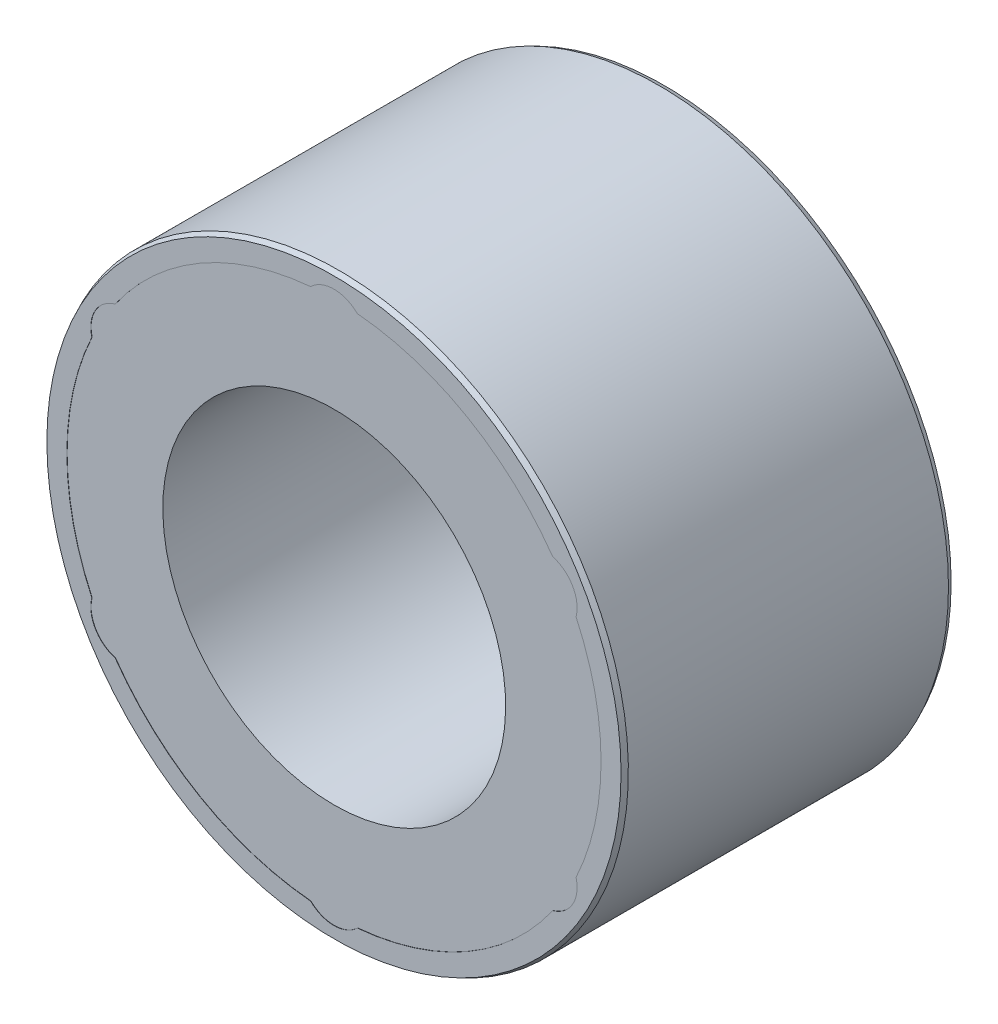
ISO-10303-21;
HEADER;
FILE_DESCRIPTION(('STEP AP214'),'2;1');
FILE_NAME('part.step','',(''),(''),'','','');
FILE_SCHEMA(('AUTOMOTIVE_DESIGN { 1 0 10303 214 1 1 1 1 }'));
ENDSEC;
DATA;
#1=APPLICATION_CONTEXT('core data for automotive mechanical design processes');
#2=APPLICATION_PROTOCOL_DEFINITION('international standard','automotive_design',2000,#1);
#3=PRODUCT_CONTEXT('',#1,'mechanical');
#4=PRODUCT('Part','Part','',(#3));
#5=PRODUCT_RELATED_PRODUCT_CATEGORY('part','',(#4));
#6=PRODUCT_DEFINITION_FORMATION('','',#4);
#7=PRODUCT_DEFINITION_CONTEXT('part definition',#1,'design');
#8=PRODUCT_DEFINITION('design','',#6,#7);
#9=PRODUCT_DEFINITION_SHAPE('','',#8);
#10=(LENGTH_UNIT() NAMED_UNIT(*) SI_UNIT(.MILLI.,.METRE.));
#11=(NAMED_UNIT(*) PLANE_ANGLE_UNIT() SI_UNIT($,.RADIAN.));
#12=(NAMED_UNIT(*) SI_UNIT($,.STERADIAN.) SOLID_ANGLE_UNIT());
#13=UNCERTAINTY_MEASURE_WITH_UNIT(LENGTH_MEASURE(1.E-05),#10,'distance_accuracy_value','');
#14=(GEOMETRIC_REPRESENTATION_CONTEXT(3) GLOBAL_UNCERTAINTY_ASSIGNED_CONTEXT((#13)) GLOBAL_UNIT_ASSIGNED_CONTEXT((#10,
#11,#12)) REPRESENTATION_CONTEXT('',''));
#15=CARTESIAN_POINT('',(0.,0.,0.));
#16=DIRECTION('',(0.,0.,1.));
#17=DIRECTION('',(1.,0.,0.));
#18=AXIS2_PLACEMENT_3D('',#15,#16,#17);
#19=CARTESIAN_POINT('',(0.,0.,-17.8020314050227));
#20=DIRECTION('',(0.,0.,1.));
#21=DIRECTION('',(1.,0.,0.));
#22=AXIS2_PLACEMENT_3D('',#19,#20,#21);
#23=CYLINDRICAL_SURFACE('',#22,54.9782499999894);
#24=CARTESIAN_POINT('',(0.,0.,-17.8020314050233));
#25=DIRECTION('',(0.,0.,1.));
#26=DIRECTION('',(0.342020143325751,-0.939692620785878,0.));
#27=AXIS2_PLACEMENT_3D('',#24,#25,#26);
#28=CIRCLE('',#27,54.9782499999998);
#29=CARTESIAN_POINT('',(18.8036689447989,-51.6626558287211,-17.8020314050233));
#30=VERTEX_POINT('',#29);
#31=EDGE_CURVE('E146',#30,#30,#28,.T.);
#32=ORIENTED_EDGE('',*,*,#31,.T.);
#33=EDGE_LOOP('',(#32));
#34=FACE_BOUND('',#33,.T.);
#35=CARTESIAN_POINT('',(-4.33343060550906E-13,-3.25965961481556E-13,43.0020314050139));
#36=DIRECTION('',(0.,0.,-1.));
#37=DIRECTION('',(0.342020143325753,-0.939692620785878,0.));
#38=AXIS2_PLACEMENT_3D('',#35,#36,#37);
#39=CIRCLE('',#38,54.9782500000053);
#40=CARTESIAN_POINT('',(18.8036689448004,-51.6626558287264,43.0020314050139));
#41=VERTEX_POINT('',#40);
#42=EDGE_CURVE('E240',#41,#41,#39,.T.);
#43=ORIENTED_EDGE('',*,*,#42,.T.);
#44=EDGE_LOOP('',(#43));
#45=FACE_BOUND('',#44,.T.);
#46=ADVANCED_FACE('F17',(#34,#45),#23,.T.);
#47=CARTESIAN_POINT('',(-4.33680868994202E-13,-3.2612801348364E-13,43.9500000000119));
#48=DIRECTION('',(0.,0.,-1.));
#49=DIRECTION('',(-1.,0.,0.));
#50=AXIS2_PLACEMENT_3D('',#47,#48,#49);
#51=CONICAL_SURFACE('',#50,54.5362050437735,0.436332261611004);
#52=CARTESIAN_POINT('',(-4.33680868994202E-13,-3.2612801348364E-13,43.9500000000109));
#53=DIRECTION('',(0.,0.,-1.));
#54=DIRECTION('',(-1.,0.,0.));
#55=AXIS2_PLACEMENT_3D('',#52,#53,#54);
#56=CIRCLE('',#55,54.536205043774);
#57=CARTESIAN_POINT('',(-54.5362050437744,-3.2612801348364E-13,43.9500000000109));
#58=VERTEX_POINT('',#57);
#59=EDGE_CURVE('E235',#58,#58,#56,.T.);
#60=ORIENTED_EDGE('',*,*,#59,.T.);
#61=EDGE_LOOP('',(#60));
#62=FACE_BOUND('',#61,.T.);
#63=ORIENTED_EDGE('',*,*,#42,.F.);
#64=EDGE_LOOP('',(#63));
#65=FACE_BOUND('',#64,.T.);
#66=ADVANCED_FACE('F653',(#62,#65),#51,.T.);
#67=CARTESIAN_POINT('',(0.,0.,-18.7499999999988));
#68=DIRECTION('',(0.,0.,1.));
#69=DIRECTION('',(1.,0.,0.));
#70=AXIS2_PLACEMENT_3D('',#67,#68,#69);
#71=CONICAL_SURFACE('',#70,54.5362050437752,0.436332261613966);
#72=CARTESIAN_POINT('',(0.,0.,-18.7499999999988));
#73=DIRECTION('',(0.,0.,1.));
#74=DIRECTION('',(1.,0.,0.));
#75=AXIS2_PLACEMENT_3D('',#72,#73,#74);
#76=CIRCLE('',#75,54.5362050437752);
#77=CARTESIAN_POINT('',(54.5362050437752,0.,-18.7499999999988));
#78=VERTEX_POINT('',#77);
#79=EDGE_CURVE('E230',#78,#78,#76,.T.);
#80=ORIENTED_EDGE('',*,*,#79,.T.);
#81=EDGE_LOOP('',(#80));
#82=FACE_BOUND('',#81,.T.);
#83=ORIENTED_EDGE('',*,*,#31,.F.);
#84=EDGE_LOOP('',(#83));
#85=FACE_BOUND('',#84,.T.);
#86=ADVANCED_FACE('F646',(#82,#85),#71,.T.);
#87=CARTESIAN_POINT('',(-33.898580331101,-72.6957401152648,43.950000000002));
#88=DIRECTION('',(0.,0.,1.));
#89=DIRECTION('',(0.939692620785899,0.342020143325696,0.));
#90=AXIS2_PLACEMENT_3D('',#87,#88,#89);
#91=PLANE('',#90);
#92=CARTESIAN_POINT('',(0.,0.,43.950000000002));
#93=DIRECTION('',(0.,0.,1.));
#94=DIRECTION('',(1.,0.,0.));
#95=AXIS2_PLACEMENT_3D('',#92,#93,#94);
#96=CIRCLE('',#95,50.7365);
#97=CARTESIAN_POINT('',(4.43690895929302,50.5421237299833,43.950000000002));
#98=VERTEX_POINT('',#97);
#99=CARTESIAN_POINT('',(41.5523086317388,29.1135377380193,43.950000000002));
#100=VERTEX_POINT('',#99);
#101=EDGE_CURVE('E224',#98,#100,#96,.F.);
#102=ORIENTED_EDGE('',*,*,#101,.T.);
#103=CARTESIAN_POINT('',(39.8366489588516,22.9997,43.950000000002));
#104=DIRECTION('',(0.,0.,1.));
#105=DIRECTION('',(1.,0.,0.));
#106=AXIS2_PLACEMENT_3D('',#103,#104,#105);
#107=CIRCLE('',#106,6.35);
#108=CARTESIAN_POINT('',(45.9892175910322,21.4285859919569,43.950000000002));
#109=VERTEX_POINT('',#108);
#110=EDGE_CURVE('E214',#100,#109,#107,.F.);
#111=ORIENTED_EDGE('',*,*,#110,.T.);
#112=CARTESIAN_POINT('',(0.,0.,43.950000000002));
#113=DIRECTION('',(0.,0.,1.));
#114=DIRECTION('',(1.,0.,0.));
#115=AXIS2_PLACEMENT_3D('',#112,#113,#114);
#116=CIRCLE('',#115,50.7365);
#117=CARTESIAN_POINT('',(45.9892175910349,-21.4285859919553,43.950000000002));
#118=VERTEX_POINT('',#117);
#119=EDGE_CURVE('E211',#109,#118,#116,.F.);
#120=ORIENTED_EDGE('',*,*,#119,.T.);
#121=CARTESIAN_POINT('',(39.8366489588516,-22.9997,43.950000000002));
#122=DIRECTION('',(0.,0.,1.));
#123=DIRECTION('',(1.,0.,0.));
#124=AXIS2_PLACEMENT_3D('',#121,#122,#123);
#125=CIRCLE('',#124,6.35);
#126=CARTESIAN_POINT('',(41.5523086317375,-29.1135377380152,43.950000000002));
#127=VERTEX_POINT('',#126);
#128=EDGE_CURVE('E208',#118,#127,#125,.F.);
#129=ORIENTED_EDGE('',*,*,#128,.T.);
#130=CARTESIAN_POINT('',(0.,0.,43.950000000002));
#131=DIRECTION('',(0.,0.,1.));
#132=DIRECTION('',(1.,0.,0.));
#133=AXIS2_PLACEMENT_3D('',#130,#131,#132);
#134=CIRCLE('',#133,50.7365);
#135=CARTESIAN_POINT('',(4.43690895929385,-50.5421237299816,43.950000000002));
#136=VERTEX_POINT('',#135);
#137=EDGE_CURVE('E204',#127,#136,#134,.F.);
#138=ORIENTED_EDGE('',*,*,#137,.T.);
#139=CARTESIAN_POINT('',(0.,-45.9994,43.950000000002));
#140=DIRECTION('',(0.,0.,1.));
#141=DIRECTION('',(1.,0.,0.));
#142=AXIS2_PLACEMENT_3D('',#139,#140,#141);
#143=CIRCLE('',#142,6.35);
#144=CARTESIAN_POINT('',(-4.43690895929303,-50.5421237299833,43.950000000002));
#145=VERTEX_POINT('',#144);
#146=EDGE_CURVE('E200',#136,#145,#143,.F.);
#147=ORIENTED_EDGE('',*,*,#146,.T.);
#148=CARTESIAN_POINT('',(0.,0.,43.950000000002));
#149=DIRECTION('',(0.,0.,1.));
#150=DIRECTION('',(1.,0.,0.));
#151=AXIS2_PLACEMENT_3D('',#148,#149,#150);
#152=CIRCLE('',#151,50.7365);
#153=CARTESIAN_POINT('',(-41.5523086317388,-29.1135377380193,43.950000000002));
#154=VERTEX_POINT('',#153);
#155=EDGE_CURVE('E196',#145,#154,#152,.F.);
#156=ORIENTED_EDGE('',*,*,#155,.T.);
#157=CARTESIAN_POINT('',(-39.8366489588516,-22.9997,43.950000000002));
#158=DIRECTION('',(0.,0.,1.));
#159=DIRECTION('',(1.,0.,0.));
#160=AXIS2_PLACEMENT_3D('',#157,#158,#159);
#161=CIRCLE('',#160,6.35);
#162=CARTESIAN_POINT('',(-45.9892175910322,-21.4285859919569,43.950000000002));
#163=VERTEX_POINT('',#162);
#164=EDGE_CURVE('E192',#154,#163,#161,.F.);
#165=ORIENTED_EDGE('',*,*,#164,.T.);
#166=CARTESIAN_POINT('',(0.,0.,43.950000000002));
#167=DIRECTION('',(0.,0.,1.));
#168=DIRECTION('',(1.,0.,0.));
#169=AXIS2_PLACEMENT_3D('',#166,#167,#168);
#170=CIRCLE('',#169,50.7365);
#171=CARTESIAN_POINT('',(-45.9892175910349,21.4285859919553,43.950000000002));
#172=VERTEX_POINT('',#171);
#173=EDGE_CURVE('E188',#163,#172,#170,.F.);
#174=ORIENTED_EDGE('',*,*,#173,.T.);
#175=CARTESIAN_POINT('',(-39.8366489588516,22.9997,43.950000000002));
#176=DIRECTION('',(0.,0.,1.));
#177=DIRECTION('',(1.,0.,0.));
#178=AXIS2_PLACEMENT_3D('',#175,#176,#177);
#179=CIRCLE('',#178,6.35);
#180=CARTESIAN_POINT('',(-41.5523086317375,29.1135377380152,43.950000000002));
#181=VERTEX_POINT('',#180);
#182=EDGE_CURVE('E184',#172,#181,#179,.F.);
#183=ORIENTED_EDGE('',*,*,#182,.T.);
#184=CARTESIAN_POINT('',(0.,0.,43.950000000002));
#185=DIRECTION('',(0.,0.,1.));
#186=DIRECTION('',(1.,0.,0.));
#187=AXIS2_PLACEMENT_3D('',#184,#185,#186);
#188=CIRCLE('',#187,50.7365);
#189=CARTESIAN_POINT('',(-4.43690895929304,50.5421237299833,43.950000000002));
#190=VERTEX_POINT('',#189);
#191=EDGE_CURVE('E179',#181,#190,#188,.F.);
#192=ORIENTED_EDGE('',*,*,#191,.T.);
#193=CARTESIAN_POINT('',(0.,45.9994,43.950000000002));
#194=DIRECTION('',(0.,0.,1.));
#195=DIRECTION('',(1.,0.,0.));
#196=AXIS2_PLACEMENT_3D('',#193,#194,#195);
#197=CIRCLE('',#196,6.35);
#198=EDGE_CURVE('E112',#190,#98,#197,.F.);
#199=ORIENTED_EDGE('',*,*,#198,.T.);
#200=EDGE_LOOP('',(#102,#111,#120,#129,#138,#147,#156,#165,#174,#183,#192,#199));
#201=FACE_BOUND('',#200,.T.);
#202=ORIENTED_EDGE('',*,*,#59,.F.);
#203=EDGE_LOOP('',(#202));
#204=FACE_BOUND('',#203,.T.);
#205=ADVANCED_FACE('F261',(#201,#204),#91,.T.);
#206=CARTESIAN_POINT('',(-33.898580330974,-72.695740115214,-18.7500000000012));
#207=DIRECTION('',(0.,0.,1.));
#208=DIRECTION('',(0.939692620785924,0.342020143325624,0.));
#209=AXIS2_PLACEMENT_3D('',#206,#207,#208);
#210=PLANE('',#209);
#211=DIRECTION('',(0.940586434343421,0.339554354307421,0.));
#212=VECTOR('',#211,1.);
#213=CARTESIAN_POINT('',(17.0270681670361,-47.5561941904999,-18.7500000000012));
#214=LINE('',#213,#212);
#215=CARTESIAN_POINT('',(17.0270681670361,-47.5561941904999,-18.7500000000002));
#216=VERTEX_POINT('',#215);
#217=CARTESIAN_POINT('',(17.276292489739,-47.4662235074419,-18.75));
#218=VERTEX_POINT('',#217);
#219=EDGE_CURVE('E120',#216,#218,#214,.T.);
#220=ORIENTED_EDGE('',*,*,#219,.T.);
#221=CARTESIAN_POINT('',(0.,0.,-18.7499999999992));
#222=DIRECTION('',(0.,0.,-1.));
#223=DIRECTION('',(-0.337086229488414,0.941473777589841,0.));
#224=AXIS2_PLACEMENT_3D('',#221,#222,#223);
#225=CIRCLE('',#224,50.5124999999955);
#226=CARTESIAN_POINT('',(-17.0270681670313,47.5561941905006,-18.7500000000002));
#227=VERTEX_POINT('',#226);
#228=EDGE_CURVE('E131',#218,#227,#225,.F.);
#229=ORIENTED_EDGE('',*,*,#228,.T.);
#230=DIRECTION('',(-0.940586434343412,-0.339554354307445,0.));
#231=VECTOR('',#230,1.);
#232=CARTESIAN_POINT('',(-17.027068167031,47.5561941904999,-18.7500000000012));
#233=LINE('',#232,#231);
#234=CARTESIAN_POINT('',(-17.2762924897388,47.4662235074414,-18.75));
#235=VERTEX_POINT('',#234);
#236=EDGE_CURVE('E126',#235,#227,#233,.F.);
#237=ORIENTED_EDGE('',*,*,#236,.F.);
#238=CARTESIAN_POINT('',(0.,0.,-18.7499999999992));
#239=DIRECTION('',(0.,0.,-1.));
#240=DIRECTION('',(0.337086159115484,-0.941473802786233,0.));
#241=AXIS2_PLACEMENT_3D('',#238,#239,#240);
#242=CIRCLE('',#241,50.5124999999944);
#243=EDGE_CURVE('E133',#235,#216,#242,.F.);
#244=ORIENTED_EDGE('',*,*,#243,.T.);
#245=EDGE_LOOP('',(#220,#229,#237,#244));
#246=FACE_BOUND('',#245,.T.);
#247=ORIENTED_EDGE('',*,*,#79,.F.);
#248=EDGE_LOOP('',(#247));
#249=FACE_BOUND('',#248,.T.);
#250=ADVANCED_FACE('F129',(#246,#249),#210,.F.);
#251=CARTESIAN_POINT('',(0.,45.9994,43.899200000002));
#252=DIRECTION('',(0.,0.,1.));
#253=DIRECTION('',(1.,0.,0.));
#254=AXIS2_PLACEMENT_3D('',#251,#252,#253);
#255=CYLINDRICAL_SURFACE('',#254,6.35);
#256=CARTESIAN_POINT('',(0.,45.9994,43.899200000002));
#257=DIRECTION('',(0.,0.,1.));
#258=DIRECTION('',(1.,0.,0.));
#259=AXIS2_PLACEMENT_3D('',#256,#257,#258);
#260=CIRCLE('',#259,6.35);
#261=CARTESIAN_POINT('',(-4.43690895929304,50.5421237299833,43.899200000002));
#262=VERTEX_POINT('',#261);
#263=CARTESIAN_POINT('',(4.43690895929302,50.5421237299833,43.899200000002));
#264=VERTEX_POINT('',#263);
#265=EDGE_CURVE('E138',#262,#264,#260,.F.);
#266=ORIENTED_EDGE('',*,*,#265,.T.);
#267=DIRECTION('',(0.,0.,-1.));
#268=VECTOR('',#267,1.);
#269=CARTESIAN_POINT('',(4.43690895929412,50.5421237299832,43.924600000002));
#270=LINE('',#269,#268);
#271=EDGE_CURVE('E141',#264,#98,#270,.F.);
#272=ORIENTED_EDGE('',*,*,#271,.T.);
#273=ORIENTED_EDGE('',*,*,#198,.F.);
#274=DIRECTION('',(0.,0.,1.));
#275=VECTOR('',#274,1.);
#276=CARTESIAN_POINT('',(-4.43690895929411,50.5421237299832,43.924600000002));
#277=LINE('',#276,#275);
#278=EDGE_CURVE('E177',#190,#262,#277,.F.);
#279=ORIENTED_EDGE('',*,*,#278,.T.);
#280=EDGE_LOOP('',(#266,#272,#273,#279));
#281=FACE_BOUND('',#280,.T.);
#282=ADVANCED_FACE('F260',(#281),#255,.F.);
#283=CARTESIAN_POINT('',(0.,0.,43.899200000002));
#284=DIRECTION('',(0.,0.,1.));
#285=DIRECTION('',(1.,0.,0.));
#286=AXIS2_PLACEMENT_3D('',#283,#284,#285);
#287=CYLINDRICAL_SURFACE('',#286,50.7365);
#288=CARTESIAN_POINT('',(0.,0.,43.899200000002));
#289=DIRECTION('',(0.,0.,1.));
#290=DIRECTION('',(1.,0.,0.));
#291=AXIS2_PLACEMENT_3D('',#288,#289,#290);
#292=CIRCLE('',#291,50.7365);
#293=CARTESIAN_POINT('',(41.5523086317388,29.1135377380193,43.899200000002));
#294=VERTEX_POINT('',#293);
#295=EDGE_CURVE('E333',#264,#294,#292,.F.);
#296=ORIENTED_EDGE('',*,*,#295,.T.);
#297=DIRECTION('',(0.,0.,-1.));
#298=VECTOR('',#297,1.);
#299=CARTESIAN_POINT('',(41.552308631744,29.1135377380178,43.924600000002));
#300=LINE('',#299,#298);
#301=EDGE_CURVE('E212',#294,#100,#300,.F.);
#302=ORIENTED_EDGE('',*,*,#301,.T.);
#303=ORIENTED_EDGE('',*,*,#101,.F.);
#304=ORIENTED_EDGE('',*,*,#271,.F.);
#305=EDGE_LOOP('',(#296,#302,#303,#304));
#306=FACE_BOUND('',#305,.T.);
#307=ADVANCED_FACE('F618',(#306),#287,.F.);
#308=CARTESIAN_POINT('',(39.8366489588516,22.9997,43.899200000002));
#309=DIRECTION('',(0.,0.,1.));
#310=DIRECTION('',(1.,0.,0.));
#311=AXIS2_PLACEMENT_3D('',#308,#309,#310);
#312=CYLINDRICAL_SURFACE('',#311,6.35);
#313=CARTESIAN_POINT('',(39.8366489588516,22.9997,43.899200000002));
#314=DIRECTION('',(0.,0.,1.));
#315=DIRECTION('',(1.,0.,0.));
#316=AXIS2_PLACEMENT_3D('',#313,#314,#315);
#317=CIRCLE('',#316,6.35);
#318=CARTESIAN_POINT('',(45.9892175910322,21.4285859919569,43.899200000002));
#319=VERTEX_POINT('',#318);
#320=EDGE_CURVE('E331',#294,#319,#317,.F.);
#321=ORIENTED_EDGE('',*,*,#320,.T.);
#322=DIRECTION('',(0.,0.,-1.));
#323=VECTOR('',#322,1.);
#324=CARTESIAN_POINT('',(45.9892175910303,21.4285859919611,43.924600000002));
#325=LINE('',#324,#323);
#326=EDGE_CURVE('E209',#319,#109,#325,.F.);
#327=ORIENTED_EDGE('',*,*,#326,.T.);
#328=ORIENTED_EDGE('',*,*,#110,.F.);
#329=ORIENTED_EDGE('',*,*,#301,.F.);
#330=EDGE_LOOP('',(#321,#327,#328,#329));
#331=FACE_BOUND('',#330,.T.);
#332=ADVANCED_FACE('F609',(#331),#312,.F.);
#333=CARTESIAN_POINT('',(0.,0.,43.899200000002));
#334=DIRECTION('',(0.,0.,1.));
#335=DIRECTION('',(1.,0.,0.));
#336=AXIS2_PLACEMENT_3D('',#333,#334,#335);
#337=CYLINDRICAL_SURFACE('',#336,50.7365);
#338=ORIENTED_EDGE('',*,*,#326,.F.);
#339=CARTESIAN_POINT('',(0.,0.,43.899200000002));
#340=DIRECTION('',(0.,0.,1.));
#341=DIRECTION('',(1.,0.,0.));
#342=AXIS2_PLACEMENT_3D('',#339,#340,#341);
#343=CIRCLE('',#342,50.7365);
#344=CARTESIAN_POINT('',(45.9892175910349,-21.4285859919553,43.899200000002));
#345=VERTEX_POINT('',#344);
#346=EDGE_CURVE('E328',#319,#345,#343,.F.);
#347=ORIENTED_EDGE('',*,*,#346,.T.);
#348=DIRECTION('',(0.,0.,-1.));
#349=VECTOR('',#348,1.);
#350=CARTESIAN_POINT('',(45.9892175910356,-21.428585991958,43.924600000002));
#351=LINE('',#350,#349);
#352=EDGE_CURVE('E205',#345,#118,#351,.F.);
#353=ORIENTED_EDGE('',*,*,#352,.T.);
#354=ORIENTED_EDGE('',*,*,#119,.F.);
#355=EDGE_LOOP('',(#338,#347,#353,#354));
#356=FACE_BOUND('',#355,.T.);
#357=ADVANCED_FACE('F601',(#356),#337,.F.);
#358=CARTESIAN_POINT('',(39.8366489588516,-22.9997,43.899200000002));
#359=DIRECTION('',(0.,0.,1.));
#360=DIRECTION('',(1.,0.,0.));
#361=AXIS2_PLACEMENT_3D('',#358,#359,#360);
#362=CYLINDRICAL_SURFACE('',#361,6.35);
#363=ORIENTED_EDGE('',*,*,#352,.F.);
#364=CARTESIAN_POINT('',(39.8366489588516,-22.9997,43.899200000002));
#365=DIRECTION('',(0.,0.,1.));
#366=DIRECTION('',(1.,0.,0.));
#367=AXIS2_PLACEMENT_3D('',#364,#365,#366);
#368=CIRCLE('',#367,6.35);
#369=CARTESIAN_POINT('',(41.5523086317375,-29.1135377380152,43.899200000002));
#370=VERTEX_POINT('',#369);
#371=EDGE_CURVE('E325',#345,#370,#368,.F.);
#372=ORIENTED_EDGE('',*,*,#371,.T.);
#373=DIRECTION('',(0.,0.,-1.));
#374=VECTOR('',#373,1.);
#375=CARTESIAN_POINT('',(41.5523086317413,-29.1135377380097,43.924600000002));
#376=LINE('',#375,#374);
#377=EDGE_CURVE('E201',#370,#127,#376,.F.);
#378=ORIENTED_EDGE('',*,*,#377,.T.);
#379=ORIENTED_EDGE('',*,*,#128,.F.);
#380=EDGE_LOOP('',(#363,#372,#378,#379));
#381=FACE_BOUND('',#380,.T.);
#382=ADVANCED_FACE('F356',(#381),#362,.F.);
#383=CARTESIAN_POINT('',(0.,0.,43.899200000002));
#384=DIRECTION('',(0.,0.,1.));
#385=DIRECTION('',(1.,0.,0.));
#386=AXIS2_PLACEMENT_3D('',#383,#384,#385);
#387=CYLINDRICAL_SURFACE('',#386,50.7365);
#388=CARTESIAN_POINT('',(0.,0.,43.899200000002));
#389=DIRECTION('',(0.,0.,1.));
#390=DIRECTION('',(1.,0.,0.));
#391=AXIS2_PLACEMENT_3D('',#388,#389,#390);
#392=CIRCLE('',#391,50.7365);
#393=CARTESIAN_POINT('',(4.43690895929385,-50.5421237299816,43.899200000002));
#394=VERTEX_POINT('',#393);
#395=EDGE_CURVE('E322',#370,#394,#392,.F.);
#396=ORIENTED_EDGE('',*,*,#395,.T.);
#397=DIRECTION('',(0.,0.,-1.));
#398=VECTOR('',#397,1.);
#399=CARTESIAN_POINT('',(4.43690895929573,-50.5421237299798,43.924600000002));
#400=LINE('',#399,#398);
#401=EDGE_CURVE('E197',#394,#136,#400,.F.);
#402=ORIENTED_EDGE('',*,*,#401,.T.);
#403=ORIENTED_EDGE('',*,*,#137,.F.);
#404=ORIENTED_EDGE('',*,*,#377,.F.);
#405=EDGE_LOOP('',(#396,#402,#403,#404));
#406=FACE_BOUND('',#405,.T.);
#407=ADVANCED_FACE('F359',(#406),#387,.F.);
#408=CARTESIAN_POINT('',(0.,-45.9994,43.899200000002));
#409=DIRECTION('',(0.,0.,1.));
#410=DIRECTION('',(1.,0.,0.));
#411=AXIS2_PLACEMENT_3D('',#408,#409,#410);
#412=CYLINDRICAL_SURFACE('',#411,6.35);
#413=CARTESIAN_POINT('',(0.,-45.9994,43.899200000002));
#414=DIRECTION('',(0.,0.,1.));
#415=DIRECTION('',(1.,0.,0.));
#416=AXIS2_PLACEMENT_3D('',#413,#414,#415);
#417=CIRCLE('',#416,6.35);
#418=CARTESIAN_POINT('',(-4.43690895929303,-50.5421237299833,43.899200000002));
#419=VERTEX_POINT('',#418);
#420=EDGE_CURVE('E319',#394,#419,#417,.F.);
#421=ORIENTED_EDGE('',*,*,#420,.T.);
#422=DIRECTION('',(0.,0.,-1.));
#423=VECTOR('',#422,1.);
#424=CARTESIAN_POINT('',(-4.43690895929414,-50.5421237299832,43.924600000002));
#425=LINE('',#424,#423);
#426=EDGE_CURVE('E193',#419,#145,#425,.F.);
#427=ORIENTED_EDGE('',*,*,#426,.T.);
#428=ORIENTED_EDGE('',*,*,#146,.F.);
#429=ORIENTED_EDGE('',*,*,#401,.F.);
#430=EDGE_LOOP('',(#421,#427,#428,#429));
#431=FACE_BOUND('',#430,.T.);
#432=ADVANCED_FACE('F366',(#431),#412,.F.);
#433=CARTESIAN_POINT('',(0.,0.,43.899200000002));
#434=DIRECTION('',(0.,0.,1.));
#435=DIRECTION('',(1.,0.,0.));
#436=AXIS2_PLACEMENT_3D('',#433,#434,#435);
#437=CYLINDRICAL_SURFACE('',#436,50.7365);
#438=CARTESIAN_POINT('',(0.,0.,43.899200000002));
#439=DIRECTION('',(0.,0.,1.));
#440=DIRECTION('',(1.,0.,0.));
#441=AXIS2_PLACEMENT_3D('',#438,#439,#440);
#442=CIRCLE('',#441,50.7365);
#443=CARTESIAN_POINT('',(-41.5523086317388,-29.1135377380193,43.899200000002));
#444=VERTEX_POINT('',#443);
#445=EDGE_CURVE('E316',#419,#444,#442,.F.);
#446=ORIENTED_EDGE('',*,*,#445,.T.);
#447=DIRECTION('',(0.,0.,-1.));
#448=VECTOR('',#447,1.);
#449=CARTESIAN_POINT('',(-41.552308631744,-29.1135377380178,43.924600000002));
#450=LINE('',#449,#448);
#451=EDGE_CURVE('E189',#444,#154,#450,.F.);
#452=ORIENTED_EDGE('',*,*,#451,.T.);
#453=ORIENTED_EDGE('',*,*,#155,.F.);
#454=ORIENTED_EDGE('',*,*,#426,.F.);
#455=EDGE_LOOP('',(#446,#452,#453,#454));
#456=FACE_BOUND('',#455,.T.);
#457=ADVANCED_FACE('F368',(#456),#437,.F.);
#458=CARTESIAN_POINT('',(-39.8366489588516,-22.9997,43.899200000002));
#459=DIRECTION('',(0.,0.,1.));
#460=DIRECTION('',(1.,0.,0.));
#461=AXIS2_PLACEMENT_3D('',#458,#459,#460);
#462=CYLINDRICAL_SURFACE('',#461,6.35);
#463=CARTESIAN_POINT('',(-39.8366489588516,-22.9997,43.899200000002));
#464=DIRECTION('',(0.,0.,1.));
#465=DIRECTION('',(1.,0.,0.));
#466=AXIS2_PLACEMENT_3D('',#463,#464,#465);
#467=CIRCLE('',#466,6.35);
#468=CARTESIAN_POINT('',(-45.9892175910322,-21.4285859919569,43.899200000002));
#469=VERTEX_POINT('',#468);
#470=EDGE_CURVE('E314',#444,#469,#467,.F.);
#471=ORIENTED_EDGE('',*,*,#470,.T.);
#472=DIRECTION('',(0.,0.,-1.));
#473=VECTOR('',#472,1.);
#474=CARTESIAN_POINT('',(-45.9892175910303,-21.4285859919611,43.924600000002));
#475=LINE('',#474,#473);
#476=EDGE_CURVE('E185',#469,#163,#475,.F.);
#477=ORIENTED_EDGE('',*,*,#476,.T.);
#478=ORIENTED_EDGE('',*,*,#164,.F.);
#479=ORIENTED_EDGE('',*,*,#451,.F.);
#480=EDGE_LOOP('',(#471,#477,#478,#479));
#481=FACE_BOUND('',#480,.T.);
#482=ADVANCED_FACE('F370',(#481),#462,.F.);
#483=CARTESIAN_POINT('',(0.,0.,43.899200000002));
#484=DIRECTION('',(0.,0.,1.));
#485=DIRECTION('',(1.,0.,0.));
#486=AXIS2_PLACEMENT_3D('',#483,#484,#485);
#487=CYLINDRICAL_SURFACE('',#486,50.7365);
#488=ORIENTED_EDGE('',*,*,#476,.F.);
#489=CARTESIAN_POINT('',(0.,0.,43.899200000002));
#490=DIRECTION('',(0.,0.,1.));
#491=DIRECTION('',(1.,0.,0.));
#492=AXIS2_PLACEMENT_3D('',#489,#490,#491);
#493=CIRCLE('',#492,50.7365);
#494=CARTESIAN_POINT('',(-45.9892175910349,21.4285859919553,43.899200000002));
#495=VERTEX_POINT('',#494);
#496=EDGE_CURVE('E311',#469,#495,#493,.F.);
#497=ORIENTED_EDGE('',*,*,#496,.T.);
#498=DIRECTION('',(0.,0.,-1.));
#499=VECTOR('',#498,1.);
#500=CARTESIAN_POINT('',(-45.9892175910356,21.428585991958,43.924600000002));
#501=LINE('',#500,#499);
#502=EDGE_CURVE('E181',#495,#172,#501,.F.);
#503=ORIENTED_EDGE('',*,*,#502,.T.);
#504=ORIENTED_EDGE('',*,*,#173,.F.);
#505=EDGE_LOOP('',(#488,#497,#503,#504));
#506=FACE_BOUND('',#505,.T.);
#507=ADVANCED_FACE('F375',(#506),#487,.F.);
#508=CARTESIAN_POINT('',(-39.8366489588516,22.9997,43.899200000002));
#509=DIRECTION('',(0.,0.,1.));
#510=DIRECTION('',(1.,0.,0.));
#511=AXIS2_PLACEMENT_3D('',#508,#509,#510);
#512=CYLINDRICAL_SURFACE('',#511,6.35);
#513=ORIENTED_EDGE('',*,*,#502,.F.);
#514=CARTESIAN_POINT('',(-39.8366489588516,22.9997,43.899200000002));
#515=DIRECTION('',(0.,0.,1.));
#516=DIRECTION('',(1.,0.,0.));
#517=AXIS2_PLACEMENT_3D('',#514,#515,#516);
#518=CIRCLE('',#517,6.35);
#519=CARTESIAN_POINT('',(-41.5523086317375,29.1135377380152,43.899200000002));
#520=VERTEX_POINT('',#519);
#521=EDGE_CURVE('E308',#495,#520,#518,.F.);
#522=ORIENTED_EDGE('',*,*,#521,.T.);
#523=DIRECTION('',(0.,0.,-1.));
#524=VECTOR('',#523,1.);
#525=CARTESIAN_POINT('',(-41.5523086317413,29.1135377380097,43.924600000002));
#526=LINE('',#525,#524);
#527=EDGE_CURVE('E38',#520,#181,#526,.F.);
#528=ORIENTED_EDGE('',*,*,#527,.T.);
#529=ORIENTED_EDGE('',*,*,#182,.F.);
#530=EDGE_LOOP('',(#513,#522,#528,#529));
#531=FACE_BOUND('',#530,.T.);
#532=ADVANCED_FACE('F377',(#531),#512,.F.);
#533=CARTESIAN_POINT('',(0.,0.,43.899200000002));
#534=DIRECTION('',(0.,0.,1.));
#535=DIRECTION('',(1.,0.,0.));
#536=AXIS2_PLACEMENT_3D('',#533,#534,#535);
#537=CYLINDRICAL_SURFACE('',#536,50.7365);
#538=CARTESIAN_POINT('',(0.,0.,43.899200000002));
#539=DIRECTION('',(0.,0.,1.));
#540=DIRECTION('',(1.,0.,0.));
#541=AXIS2_PLACEMENT_3D('',#538,#539,#540);
#542=CIRCLE('',#541,50.7365);
#543=EDGE_CURVE('E176',#520,#262,#542,.F.);
#544=ORIENTED_EDGE('',*,*,#543,.T.);
#545=ORIENTED_EDGE('',*,*,#278,.F.);
#546=ORIENTED_EDGE('',*,*,#191,.F.);
#547=ORIENTED_EDGE('',*,*,#527,.F.);
#548=EDGE_LOOP('',(#544,#545,#546,#547));
#549=FACE_BOUND('',#548,.T.);
#550=ADVANCED_FACE('F159',(#549),#537,.F.);
#551=CARTESIAN_POINT('',(16.9832650347526,-47.4338642617394,-18.615916601319));
#552=CARTESIAN_POINT('',(16.9824179649364,-47.4314984154433,-18.6958789429001));
#553=CARTESIAN_POINT('',(17.0014868709001,-47.4847574263137,-18.7524487706667));
#554=CARTESIAN_POINT('',(17.0284410694976,-47.5600398761217,-18.7499358528467));
#555=(BOUNDED_CURVE() B_SPLINE_CURVE(3,(#551,#552,#553,#554),.UNSPECIFIED.,.F.,
.F.) B_SPLINE_CURVE_WITH_KNOTS((4,4),(0.,1.),
.UNSPECIFIED.) CURVE() GEOMETRIC_REPRESENTATION_ITEM() RATIONAL_B_SPLINE_CURVE((1.,
0.789698070619091,0.789698070619091,1.)) REPRESENTATION_ITEM(''));
#556=CARTESIAN_POINT('',(0.,0.,-18.6199999999992));
#557=DIRECTION('',(0.,0.,1.));
#558=AXIS1_PLACEMENT('',#556,#557);
#559=SURFACE_OF_REVOLUTION('',#555,#558);
#560=CARTESIAN_POINT('',(0.,0.,-18.6199999999992));
#561=DIRECTION('',(0.,0.,1.));
#562=DIRECTION('',(-0.342020143325583,0.93969262078594,0.));
#563=AXIS2_PLACEMENT_3D('',#560,#561,#562);
#564=CIRCLE('',#563,50.3825000000036);
#565=CARTESIAN_POINT('',(-17.2318298711024,47.344063466751,-18.6199999999992));
#566=VERTEX_POINT('',#565);
#567=EDGE_CURVE('E169',#566,#566,#564,.T.);
#568=ORIENTED_EDGE('',*,*,#567,.T.);
#569=EDGE_LOOP('',(#568));
#570=FACE_BOUND('',#569,.T.);
#571=ORIENTED_EDGE('',*,*,#228,.F.);
#572=ORIENTED_EDGE('',*,*,#219,.F.);
#573=ORIENTED_EDGE('',*,*,#243,.F.);
#574=ORIENTED_EDGE('',*,*,#236,.T.);
#575=EDGE_LOOP('',(#571,#572,#573,#574));
#576=FACE_BOUND('',#575,.T.);
#577=ADVANCED_FACE('F137',(#570,#576),#559,.T.);
#578=CARTESIAN_POINT('',(-52.76596,-54.454955614128,43.899200000002));
#579=DIRECTION('',(0.,0.,1.));
#580=DIRECTION('',(1.,0.,0.));
#581=AXIS2_PLACEMENT_3D('',#578,#579,#580);
#582=PLANE('',#581);
#583=CARTESIAN_POINT('',(0.,0.,43.899200000002));
#584=DIRECTION('',(0.,0.,1.));
#585=DIRECTION('',(0.,-1.,0.));
#586=AXIS2_PLACEMENT_3D('',#583,#584,#585);
#587=CIRCLE('',#586,32.5600000000103);
#588=CARTESIAN_POINT('',(0.,-32.5600000000103,43.899200000002));
#589=VERTEX_POINT('',#588);
#590=EDGE_CURVE('E175',#589,#589,#587,.F.);
#591=ORIENTED_EDGE('',*,*,#590,.T.);
#592=EDGE_LOOP('',(#591));
#593=FACE_BOUND('',#592,.T.);
#594=ORIENTED_EDGE('',*,*,#521,.F.);
#595=ORIENTED_EDGE('',*,*,#496,.F.);
#596=ORIENTED_EDGE('',*,*,#470,.F.);
#597=ORIENTED_EDGE('',*,*,#445,.F.);
#598=ORIENTED_EDGE('',*,*,#420,.F.);
#599=ORIENTED_EDGE('',*,*,#395,.F.);
#600=ORIENTED_EDGE('',*,*,#371,.F.);
#601=ORIENTED_EDGE('',*,*,#346,.F.);
#602=ORIENTED_EDGE('',*,*,#320,.F.);
#603=ORIENTED_EDGE('',*,*,#295,.F.);
#604=ORIENTED_EDGE('',*,*,#265,.F.);
#605=ORIENTED_EDGE('',*,*,#543,.F.);
#606=EDGE_LOOP('',(#594,#595,#596,#597,#598,#599,#600,#601,#602,#603,#604,#605));
#607=FACE_BOUND('',#606,.T.);
#608=ADVANCED_FACE('F158',(#593,#607),#582,.T.);
#609=CARTESIAN_POINT('',(-8.88078184498448,41.5355574311574,-24.2698000000007));
#610=DIRECTION('',(0.,0.,1.));
#611=DIRECTION('',(0.342020143323408,-0.939692620786731,0.));
#612=AXIS2_PLACEMENT_3D('',#609,#610,#611);
#613=PLANE('',#612);
#614=CARTESIAN_POINT('',(-7.18497118805277,40.7479964732878,-24.2698000000007));
#615=DIRECTION('',(0.,0.,-1.));
#616=DIRECTION('',(-1.,0.,0.));
#617=AXIS2_PLACEMENT_3D('',#614,#615,#616);
#618=CIRCLE('',#617,1.06800000000022);
#619=CARTESIAN_POINT('',(-8.25297118805299,40.7479964732878,-24.2698000000007));
#620=VERTEX_POINT('',#619);
#621=EDGE_CURVE('E302',#620,#620,#618,.T.);
#622=ORIENTED_EDGE('',*,*,#621,.T.);
#623=EDGE_LOOP('',(#622));
#624=FACE_BOUND('',#623,.T.);
#625=ADVANCED_FACE('F425',(#624),#613,.F.);
#626=CARTESIAN_POINT('',(4.0626990722488,41.7614867309616,-24.1936000000007));
#627=DIRECTION('',(0.,0.,1.));
#628=DIRECTION('',(0.34202014332341,-0.93969262078673,0.));
#629=AXIS2_PLACEMENT_3D('',#626,#627,#628);
#630=PLANE('',#629);
#631=CARTESIAN_POINT('',(5.75850972918306,40.973925773092,-24.1936000000007));
#632=DIRECTION('',(0.,0.,-1.));
#633=DIRECTION('',(-1.,0.,0.));
#634=AXIS2_PLACEMENT_3D('',#631,#632,#633);
#635=CIRCLE('',#634,1.06800000000108);
#636=CARTESIAN_POINT('',(4.69050972918198,40.973925773092,-24.1936000000007));
#637=VERTEX_POINT('',#636);
#638=EDGE_CURVE('E299',#637,#637,#635,.T.);
#639=ORIENTED_EDGE('',*,*,#638,.T.);
#640=EDGE_LOOP('',(#639));
#641=FACE_BOUND('',#640,.T.);
#642=ADVANCED_FACE('F429',(#641),#630,.F.);
#643=CARTESIAN_POINT('',(-11.8450356294877,40.5529691282404,-24.2698000000007));
#644=DIRECTION('',(0.,0.,1.));
#645=DIRECTION('',(0.342020143323338,-0.939692620786757,0.));
#646=AXIS2_PLACEMENT_3D('',#643,#644,#645);
#647=PLANE('',#646);
#648=CARTESIAN_POINT('',(-10.9988810373425,40.1601122499222,-24.2698000000007));
#649=DIRECTION('',(0.,0.,-1.));
#650=DIRECTION('',(-1.,0.,0.));
#651=AXIS2_PLACEMENT_3D('',#648,#649,#650);
#652=CIRCLE('',#651,0.406500000004177);
#653=CARTESIAN_POINT('',(-11.4053810373467,40.1601122499222,-24.2698000000007));
#654=VERTEX_POINT('',#653);
#655=EDGE_CURVE('E296',#654,#654,#652,.T.);
#656=ORIENTED_EDGE('',*,*,#655,.T.);
#657=EDGE_LOOP('',(#656));
#658=FACE_BOUND('',#657,.T.);
#659=ADVANCED_FACE('F434',(#658),#647,.F.);
#660=CARTESIAN_POINT('',(-12.8016567027695,39.6726986458588,-24.2698000000007));
#661=DIRECTION('',(0.,0.,1.));
#662=DIRECTION('',(0.342020143323346,-0.939692620786754,0.));
#663=AXIS2_PLACEMENT_3D('',#660,#661,#662);
#664=PLANE('',#663);
#665=CARTESIAN_POINT('',(-11.9555021106244,39.2798417675406,-24.2698000000007));
#666=DIRECTION('',(0.,0.,-1.));
#667=DIRECTION('',(-1.,0.,0.));
#668=AXIS2_PLACEMENT_3D('',#665,#666,#667);
#669=CIRCLE('',#668,0.4065000000042);
#670=CARTESIAN_POINT('',(-12.3620021106286,39.2798417675406,-24.2698000000007));
#671=VERTEX_POINT('',#670);
#672=EDGE_CURVE('E293',#671,#671,#669,.T.);
#673=ORIENTED_EDGE('',*,*,#672,.T.);
#674=EDGE_LOOP('',(#673));
#675=FACE_BOUND('',#674,.T.);
#676=ADVANCED_FACE('F418',(#675),#664,.F.);
#677=CARTESIAN_POINT('',(0.,0.,-18.6199999999992));
#678=DIRECTION('',(0.,0.,1.));
#679=DIRECTION('',(1.,0.,0.));
#680=AXIS2_PLACEMENT_3D('',#677,#678,#679);
#681=CYLINDRICAL_SURFACE('',#680,50.3825000000036);
#682=ORIENTED_EDGE('',*,*,#567,.F.);
#683=EDGE_LOOP('',(#682));
#684=FACE_BOUND('',#683,.T.);
#685=CARTESIAN_POINT('',(0.,0.,-15.5199999999989));
#686=DIRECTION('',(0.,0.,1.));
#687=DIRECTION('',(1.,0.,0.));
#688=AXIS2_PLACEMENT_3D('',#685,#686,#687);
#689=CIRCLE('',#688,50.3825000000036);
#690=CARTESIAN_POINT('',(50.3825000000036,0.,-15.5199999999989));
#691=VERTEX_POINT('',#690);
#692=EDGE_CURVE('E290',#691,#691,#689,.T.);
#693=ORIENTED_EDGE('',*,*,#692,.T.);
#694=EDGE_LOOP('',(#693));
#695=FACE_BOUND('',#694,.T.);
#696=ADVANCED_FACE('F161',(#684,#695),#681,.F.);
#697=CARTESIAN_POINT('',(0.,0.,-15.5199999999989));
#698=DIRECTION('',(0.,0.,1.));
#699=DIRECTION('',(0.,-1.,0.));
#700=AXIS2_PLACEMENT_3D('',#697,#698,#699);
#701=CYLINDRICAL_SURFACE('',#700,32.5600000000103);
#702=CARTESIAN_POINT('',(0.,0.,-15.5199999999989));
#703=DIRECTION('',(0.,0.,1.));
#704=DIRECTION('',(0.,-1.,0.));
#705=AXIS2_PLACEMENT_3D('',#702,#703,#704);
#706=CIRCLE('',#705,32.5600000000103);
#707=CARTESIAN_POINT('',(0.,-32.5600000000103,-15.5199999999989));
#708=VERTEX_POINT('',#707);
#709=EDGE_CURVE('E287',#708,#708,#706,.F.);
#710=ORIENTED_EDGE('',*,*,#709,.T.);
#711=EDGE_LOOP('',(#710));
#712=FACE_BOUND('',#711,.T.);
#713=ORIENTED_EDGE('',*,*,#590,.F.);
#714=EDGE_LOOP('',(#713));
#715=FACE_BOUND('',#714,.T.);
#716=ADVANCED_FACE('F411',(#712,#715),#701,.F.);
#717=CARTESIAN_POINT('',(-7.18497118805276,40.7479964732878,-15.5199999999989));
#718=DIRECTION('',(0.,0.,-1.));
#719=DIRECTION('',(-1.,0.,0.));
#720=AXIS2_PLACEMENT_3D('',#717,#718,#719);
#721=CYLINDRICAL_SURFACE('',#720,1.06800000000022);
#722=ORIENTED_EDGE('',*,*,#621,.F.);
#723=EDGE_LOOP('',(#722));
#724=FACE_BOUND('',#723,.T.);
#725=CARTESIAN_POINT('',(-7.18497118805276,40.7479964732878,-15.5199999999989));
#726=DIRECTION('',(0.,0.,-1.));
#727=DIRECTION('',(-1.,0.,0.));
#728=AXIS2_PLACEMENT_3D('',#725,#726,#727);
#729=CIRCLE('',#728,1.06800000000022);
#730=CARTESIAN_POINT('',(-8.25297118805298,40.7479964732878,-15.5199999999989));
#731=VERTEX_POINT('',#730);
#732=EDGE_CURVE('E284',#731,#731,#729,.T.);
#733=ORIENTED_EDGE('',*,*,#732,.T.);
#734=EDGE_LOOP('',(#733));
#735=FACE_BOUND('',#734,.T.);
#736=ADVANCED_FACE('F408',(#724,#735),#721,.T.);
#737=CARTESIAN_POINT('',(5.75850972918306,40.973925773092,-15.5199999999989));
#738=DIRECTION('',(0.,0.,-1.));
#739=DIRECTION('',(-1.,0.,0.));
#740=AXIS2_PLACEMENT_3D('',#737,#738,#739);
#741=CYLINDRICAL_SURFACE('',#740,1.06800000000108);
#742=ORIENTED_EDGE('',*,*,#638,.F.);
#743=EDGE_LOOP('',(#742));
#744=FACE_BOUND('',#743,.T.);
#745=CARTESIAN_POINT('',(5.75850972918306,40.973925773092,-15.5199999999989));
#746=DIRECTION('',(0.,0.,-1.));
#747=DIRECTION('',(-1.,0.,0.));
#748=AXIS2_PLACEMENT_3D('',#745,#746,#747);
#749=CIRCLE('',#748,1.06800000000108);
#750=CARTESIAN_POINT('',(4.69050972918199,40.973925773092,-15.5199999999989));
#751=VERTEX_POINT('',#750);
#752=EDGE_CURVE('E281',#751,#751,#749,.T.);
#753=ORIENTED_EDGE('',*,*,#752,.T.);
#754=EDGE_LOOP('',(#753));
#755=FACE_BOUND('',#754,.T.);
#756=ADVANCED_FACE('F404',(#744,#755),#741,.T.);
#757=CARTESIAN_POINT('',(-10.9988810373425,40.1601122499222,-15.5199999999989));
#758=DIRECTION('',(0.,0.,-1.));
#759=DIRECTION('',(-1.,0.,0.));
#760=AXIS2_PLACEMENT_3D('',#757,#758,#759);
#761=CYLINDRICAL_SURFACE('',#760,0.406500000004177);
#762=ORIENTED_EDGE('',*,*,#655,.F.);
#763=EDGE_LOOP('',(#762));
#764=FACE_BOUND('',#763,.T.);
#765=CARTESIAN_POINT('',(-10.9988810373425,40.1601122499222,-15.5199999999989));
#766=DIRECTION('',(0.,0.,-1.));
#767=DIRECTION('',(-1.,0.,0.));
#768=AXIS2_PLACEMENT_3D('',#765,#766,#767);
#769=CIRCLE('',#768,0.406500000004177);
#770=CARTESIAN_POINT('',(-11.4053810373467,40.1601122499222,-15.5199999999989));
#771=VERTEX_POINT('',#770);
#772=EDGE_CURVE('E278',#771,#771,#769,.T.);
#773=ORIENTED_EDGE('',*,*,#772,.T.);
#774=EDGE_LOOP('',(#773));
#775=FACE_BOUND('',#774,.T.);
#776=ADVANCED_FACE('F400',(#764,#775),#761,.T.);
#777=CARTESIAN_POINT('',(-11.9555021106244,39.2798417675406,-15.5199999999989));
#778=DIRECTION('',(0.,0.,-1.));
#779=DIRECTION('',(-1.,0.,0.));
#780=AXIS2_PLACEMENT_3D('',#777,#778,#779);
#781=CYLINDRICAL_SURFACE('',#780,0.4065000000042);
#782=ORIENTED_EDGE('',*,*,#672,.F.);
#783=EDGE_LOOP('',(#782));
#784=FACE_BOUND('',#783,.T.);
#785=CARTESIAN_POINT('',(-11.9555021106244,39.2798417675406,-15.5199999999989));
#786=DIRECTION('',(0.,0.,-1.));
#787=DIRECTION('',(-1.,0.,0.));
#788=AXIS2_PLACEMENT_3D('',#785,#786,#787);
#789=CIRCLE('',#788,0.4065000000042);
#790=CARTESIAN_POINT('',(-12.3620021106286,39.2798417675406,-15.5199999999989));
#791=VERTEX_POINT('',#790);
#792=EDGE_CURVE('E275',#791,#791,#789,.T.);
#793=ORIENTED_EDGE('',*,*,#792,.T.);
#794=EDGE_LOOP('',(#793));
#795=FACE_BOUND('',#794,.T.);
#796=ADVANCED_FACE('F397',(#784,#795),#781,.T.);
#797=CARTESIAN_POINT('',(31.3506188065872,67.1712661580626,-15.5199999999989));
#798=DIRECTION('',(0.,0.,1.));
#799=DIRECTION('',(-0.939692620785927,-0.342020143325617,0.));
#800=AXIS2_PLACEMENT_3D('',#797,#798,#799);
#801=PLANE('',#800);
#802=ORIENTED_EDGE('',*,*,#792,.F.);
#803=EDGE_LOOP('',(#802));
#804=FACE_BOUND('',#803,.T.);
#805=ORIENTED_EDGE('',*,*,#772,.F.);
#806=EDGE_LOOP('',(#805));
#807=FACE_BOUND('',#806,.T.);
#808=ORIENTED_EDGE('',*,*,#752,.F.);
#809=EDGE_LOOP('',(#808));
#810=FACE_BOUND('',#809,.T.);
#811=CARTESIAN_POINT('',(-0.722121240193036,41.370298143414,-15.5199999999989));
#812=DIRECTION('',(0.,0.,-1.));
#813=DIRECTION('',(-1.,0.,0.));
#814=AXIS2_PLACEMENT_3D('',#811,#812,#813);
#815=CIRCLE('',#814,1.06800000000064);
#816=CARTESIAN_POINT('',(-1.79012124019368,41.370298143414,-15.5199999999989));
#817=VERTEX_POINT('',#816);
#818=EDGE_CURVE('E29',#817,#817,#815,.F.);
#819=ORIENTED_EDGE('',*,*,#818,.T.);
#820=EDGE_LOOP('',(#819));
#821=FACE_BOUND('',#820,.T.);
#822=ORIENTED_EDGE('',*,*,#732,.F.);
#823=EDGE_LOOP('',(#822));
#824=FACE_BOUND('',#823,.T.);
#825=ORIENTED_EDGE('',*,*,#709,.F.);
#826=EDGE_LOOP('',(#825));
#827=FACE_BOUND('',#826,.T.);
#828=ORIENTED_EDGE('',*,*,#692,.F.);
#829=EDGE_LOOP('',(#828));
#830=FACE_BOUND('',#829,.T.);
#831=ADVANCED_FACE('F392',(#804,#807,#810,#821,#824,#827,#830),#801,.F.);
#832=CARTESIAN_POINT('',(-2.41793189712577,42.1578591012836,-24.1936000000007));
#833=DIRECTION('',(0.,0.,1.));
#834=DIRECTION('',(0.342020143323583,-0.939692620786668,0.));
#835=AXIS2_PLACEMENT_3D('',#832,#833,#834);
#836=PLANE('',#835);
#837=CARTESIAN_POINT('',(-0.722121240193043,41.370298143414,-24.1936000000007));
#838=DIRECTION('',(0.,0.,-1.));
#839=DIRECTION('',(-1.,0.,0.));
#840=AXIS2_PLACEMENT_3D('',#837,#838,#839);
#841=CIRCLE('',#840,1.06800000000064);
#842=CARTESIAN_POINT('',(-1.79012124019368,41.370298143414,-24.1936000000007));
#843=VERTEX_POINT('',#842);
#844=EDGE_CURVE('E11',#843,#843,#841,.T.);
#845=ORIENTED_EDGE('',*,*,#844,.T.);
#846=EDGE_LOOP('',(#845));
#847=FACE_BOUND('',#846,.T.);
#848=ADVANCED_FACE('F19',(#847),#836,.F.);
#849=CARTESIAN_POINT('',(-0.722121240193036,41.370298143414,-15.5199999999989));
#850=DIRECTION('',(0.,0.,-1.));
#851=DIRECTION('',(-1.,0.,0.));
#852=AXIS2_PLACEMENT_3D('',#849,#850,#851);
#853=CYLINDRICAL_SURFACE('',#852,1.06800000000064);
#854=ORIENTED_EDGE('',*,*,#844,.F.);
#855=EDGE_LOOP('',(#854));
#856=FACE_BOUND('',#855,.T.);
#857=ORIENTED_EDGE('',*,*,#818,.F.);
#858=EDGE_LOOP('',(#857));
#859=FACE_BOUND('',#858,.T.);
#860=ADVANCED_FACE('F385',(#856,#859),#853,.T.);
#861=CLOSED_SHELL('',(#46,#66,#86,#205,#250,#282,#307,#332,#357,#382,#407,#432,#457,#482,#507,
#532,#550,#577,#608,#625,#642,#659,#676,#696,#716,#736,#756,#776,#796,#831,#848,#860));
#862=MANIFOLD_SOLID_BREP('B1',#861);
#863=ADVANCED_BREP_SHAPE_REPRESENTATION('',(#18,#862),#14);
#864=SHAPE_DEFINITION_REPRESENTATION(#9,#863);
ENDSEC;
END-ISO-10303-21;
